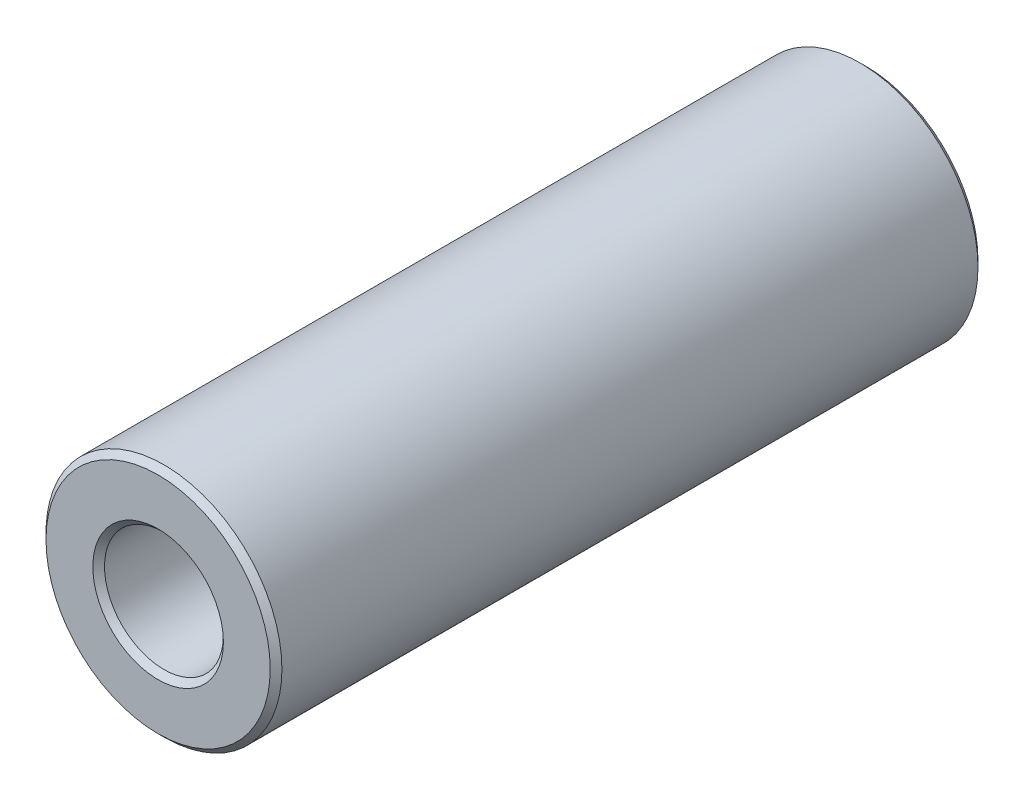
ISO-10303-21;
HEADER;
FILE_DESCRIPTION(('STEP AP214'),'2;1');
FILE_NAME('part.step','',(''),(''),'','','');
FILE_SCHEMA(('AUTOMOTIVE_DESIGN { 1 0 10303 214 1 1 1 1 }'));
ENDSEC;
DATA;
#1=APPLICATION_CONTEXT('core data for automotive mechanical design processes');
#2=APPLICATION_PROTOCOL_DEFINITION('international standard','automotive_design',2000,#1);
#3=PRODUCT_CONTEXT('',#1,'mechanical');
#4=PRODUCT('Part','Part','',(#3));
#5=PRODUCT_RELATED_PRODUCT_CATEGORY('part','',(#4));
#6=PRODUCT_DEFINITION_FORMATION('','',#4);
#7=PRODUCT_DEFINITION_CONTEXT('part definition',#1,'design');
#8=PRODUCT_DEFINITION('design','',#6,#7);
#9=PRODUCT_DEFINITION_SHAPE('','',#8);
#10=(LENGTH_UNIT() NAMED_UNIT(*) SI_UNIT(.MILLI.,.METRE.));
#11=(NAMED_UNIT(*) PLANE_ANGLE_UNIT() SI_UNIT($,.RADIAN.));
#12=(NAMED_UNIT(*) SI_UNIT($,.STERADIAN.) SOLID_ANGLE_UNIT());
#13=UNCERTAINTY_MEASURE_WITH_UNIT(LENGTH_MEASURE(1.E-05),#10,'distance_accuracy_value','');
#14=(GEOMETRIC_REPRESENTATION_CONTEXT(3) GLOBAL_UNCERTAINTY_ASSIGNED_CONTEXT((#13)) GLOBAL_UNIT_ASSIGNED_CONTEXT((#10,
#11,#12)) REPRESENTATION_CONTEXT('',''));
#15=CARTESIAN_POINT('',(0.,0.,0.));
#16=DIRECTION('',(0.,0.,1.));
#17=DIRECTION('',(1.,0.,0.));
#18=AXIS2_PLACEMENT_3D('',#15,#16,#17);
#19=CARTESIAN_POINT('',(0.,0.,-19.05));
#20=DIRECTION('',(0.,0.,1.));
#21=DIRECTION('',(1.,0.,0.));
#22=AXIS2_PLACEMENT_3D('',#19,#20,#21);
#23=CYLINDRICAL_SURFACE('',#22,6.35);
#24=CARTESIAN_POINT('',(0.,0.,18.73504));
#25=DIRECTION('',(0.,0.,1.));
#26=DIRECTION('',(1.,0.,0.));
#27=AXIS2_PLACEMENT_3D('',#24,#25,#26);
#28=CIRCLE('',#27,6.35);
#29=CARTESIAN_POINT('',(6.35,0.,18.73504));
#30=VERTEX_POINT('',#29);
#31=EDGE_CURVE('E55',#30,#30,#28,.F.);
#32=CARTESIAN_POINT('',(0.,0.,-18.73504));
#33=DIRECTION('',(0.,0.,1.));
#34=DIRECTION('',(1.,0.,0.));
#35=AXIS2_PLACEMENT_3D('',#32,#33,#34);
#36=CIRCLE('',#35,6.35);
#37=CARTESIAN_POINT('',(6.35,0.,-18.73504));
#38=VERTEX_POINT('',#37);
#39=EDGE_CURVE('E58',#38,#38,#36,.T.);
#40=CARTESIAN_POINT('',(6.35,0.,18.73504));
#41=CARTESIAN_POINT('',(6.35,0.,18.3447266666667));
#42=CARTESIAN_POINT('',(6.35,0.,17.9544133333333));
#43=CARTESIAN_POINT('',(6.35,0.,17.1737866666667));
#44=CARTESIAN_POINT('',(6.35,0.,16.7834733333333));
#45=CARTESIAN_POINT('',(6.35,0.,16.0028466666667));
#46=CARTESIAN_POINT('',(6.35,0.,15.6125333333333));
#47=CARTESIAN_POINT('',(6.35,0.,14.8319066666667));
#48=CARTESIAN_POINT('',(6.35,0.,14.4415933333333));
#49=CARTESIAN_POINT('',(6.35,0.,13.6609666666667));
#50=CARTESIAN_POINT('',(6.35,0.,13.2706533333333));
#51=CARTESIAN_POINT('',(6.35,0.,12.4900266666667));
#52=CARTESIAN_POINT('',(6.35,0.,12.0997133333333));
#53=CARTESIAN_POINT('',(6.35,0.,11.3190866666667));
#54=CARTESIAN_POINT('',(6.35,0.,10.9287733333333));
#55=CARTESIAN_POINT('',(6.35,0.,10.1481466666667));
#56=CARTESIAN_POINT('',(6.35,0.,9.75783333333334));
#57=CARTESIAN_POINT('',(6.35,0.,8.97720666666667));
#58=CARTESIAN_POINT('',(6.35,0.,8.58689333333334));
#59=CARTESIAN_POINT('',(6.35,0.,7.80626666666667));
#60=CARTESIAN_POINT('',(6.35,0.,7.41595333333334));
#61=CARTESIAN_POINT('',(6.35,0.,6.63532666666667));
#62=CARTESIAN_POINT('',(6.35,0.,6.24501333333334));
#63=CARTESIAN_POINT('',(6.35,0.,5.46438666666667));
#64=CARTESIAN_POINT('',(6.35,0.,5.07407333333334));
#65=CARTESIAN_POINT('',(6.35,0.,4.29344666666668));
#66=CARTESIAN_POINT('',(6.35,0.,3.90313333333334));
#67=CARTESIAN_POINT('',(6.35,0.,3.12250666666667));
#68=CARTESIAN_POINT('',(6.35,0.,2.73219333333334));
#69=CARTESIAN_POINT('',(6.35,0.,1.95156666666668));
#70=CARTESIAN_POINT('',(6.35,0.,1.56125333333334));
#71=CARTESIAN_POINT('',(6.35,0.,0.780626666666676));
#72=CARTESIAN_POINT('',(6.35,0.,0.390313333333343));
#73=CARTESIAN_POINT('',(6.35,0.,-0.390313333333323));
#74=CARTESIAN_POINT('',(6.35,0.,-0.780626666666655));
#75=CARTESIAN_POINT('',(6.35,0.,-1.56125333333332));
#76=CARTESIAN_POINT('',(6.35,0.,-1.95156666666665));
#77=CARTESIAN_POINT('',(6.35,0.,-2.73219333333332));
#78=CARTESIAN_POINT('',(6.35,0.,-3.12250666666665));
#79=CARTESIAN_POINT('',(6.35,0.,-3.90313333333332));
#80=CARTESIAN_POINT('',(6.35,0.,-4.29344666666665));
#81=CARTESIAN_POINT('',(6.35,0.,-5.07407333333332));
#82=CARTESIAN_POINT('',(6.35,0.,-5.46438666666665));
#83=CARTESIAN_POINT('',(6.35,0.,-6.24501333333332));
#84=CARTESIAN_POINT('',(6.35,0.,-6.63532666666665));
#85=CARTESIAN_POINT('',(6.35,0.,-7.41595333333332));
#86=CARTESIAN_POINT('',(6.35,0.,-7.80626666666665));
#87=CARTESIAN_POINT('',(6.35,0.,-8.58689333333332));
#88=CARTESIAN_POINT('',(6.35,0.,-8.97720666666665));
#89=CARTESIAN_POINT('',(6.35,0.,-9.75783333333332));
#90=CARTESIAN_POINT('',(6.35,0.,-10.1481466666666));
#91=CARTESIAN_POINT('',(6.35,0.,-10.9287733333333));
#92=CARTESIAN_POINT('',(6.35,0.,-11.3190866666666));
#93=CARTESIAN_POINT('',(6.35,0.,-12.0997133333333));
#94=CARTESIAN_POINT('',(6.35,0.,-12.4900266666666));
#95=CARTESIAN_POINT('',(6.35,0.,-13.2706533333333));
#96=CARTESIAN_POINT('',(6.35,0.,-13.6609666666666));
#97=CARTESIAN_POINT('',(6.35,0.,-14.4415933333333));
#98=CARTESIAN_POINT('',(6.35,0.,-14.8319066666666));
#99=CARTESIAN_POINT('',(6.35,0.,-15.6125333333333));
#100=CARTESIAN_POINT('',(6.35,0.,-16.0028466666666));
#101=CARTESIAN_POINT('',(6.35,0.,-16.7834733333333));
#102=CARTESIAN_POINT('',(6.35,0.,-17.1737866666666));
#103=CARTESIAN_POINT('',(6.35,0.,-17.9544133333333));
#104=CARTESIAN_POINT('',(6.35,0.,-18.3447266666666));
#105=CARTESIAN_POINT('',(6.35,0.,-18.73504));
#106=B_SPLINE_CURVE_WITH_KNOTS('',3,(#40,#41,#42,#43,#44,#45,#46,#47,#48,#49,#50,#51,#52,#53,
#54,#55,#56,#57,#58,#59,#60,#61,#62,#63,#64,#65,#66,#67,#68,#69,#70,#71,#72,#73,#74,#75,#76,#77,
#78,#79,#80,#81,#82,#83,#84,#85,#86,#87,#88,#89,#90,#91,#92,#93,#94,#95,#96,#97,#98,#99,#100,
#101,#102,#103,#104,#105),.UNSPECIFIED.,.F.,.F.,(4,2,2,2,2,2,2,2,2,2,2,2,2,2,2,2,2,2,2,2,2,2,2,
2,2,2,2,2,2,2,2,2,4),(0.,1.17094,2.34188,3.51282,4.68376,5.8547,7.02563999999999,
8.19657999999999,9.36751999999999,10.53846,11.7094,12.88034,14.05128,15.22222,16.39316,17.5641,
18.73504,19.90598,21.07692,22.24786,23.4188,24.58974,25.76068,26.93162,28.10256,29.2735,
30.44444,31.61538,32.78632,33.95726,35.1282,36.29914,37.47008),.UNSPECIFIED.);
#107=EDGE_CURVE('BSEAM35',#30,#38,#106,.T.);
#108=ORIENTED_EDGE('',*,*,#31,.T.);
#109=ORIENTED_EDGE('',*,*,#39,.T.);
#110=ORIENTED_EDGE('',*,*,#107,.T.);
#111=ORIENTED_EDGE('',*,*,#107,.F.);
#112=EDGE_LOOP('',(#108,#110,#109,#111));
#113=FACE_BOUND('',#112,.T.);
#114=ADVANCED_FACE('F35',(#113),#23,.T.);
#115=CARTESIAN_POINT('',(0.,0.,-19.05));
#116=DIRECTION('',(0.,0.,1.));
#117=DIRECTION('',(1.,0.,0.));
#118=AXIS2_PLACEMENT_3D('',#115,#116,#117);
#119=PLANE('',#118);
#120=CARTESIAN_POINT('',(0.,0.,-19.05));
#121=DIRECTION('',(0.,0.,1.));
#122=DIRECTION('',(1.,0.,0.));
#123=AXIS2_PLACEMENT_3D('',#120,#121,#122);
#124=CIRCLE('',#123,6.03503999999998);
#125=CARTESIAN_POINT('',(6.03503999999998,0.,-19.05));
#126=VERTEX_POINT('',#125);
#127=EDGE_CURVE('E46',#126,#126,#124,.F.);
#128=ORIENTED_EDGE('',*,*,#127,.T.);
#129=EDGE_LOOP('',(#128));
#130=FACE_BOUND('',#129,.T.);
#131=CARTESIAN_POINT('',(0.,0.,-19.05));
#132=DIRECTION('',(0.,0.,1.));
#133=DIRECTION('',(1.,0.,0.));
#134=AXIS2_PLACEMENT_3D('',#131,#132,#133);
#135=CIRCLE('',#134,3.51535999999998);
#136=CARTESIAN_POINT('',(3.51535999999998,0.,-19.05));
#137=VERTEX_POINT('',#136);
#138=EDGE_CURVE('E50',#137,#137,#135,.T.);
#139=ORIENTED_EDGE('',*,*,#138,.T.);
#140=EDGE_LOOP('',(#139));
#141=FACE_BOUND('',#140,.T.);
#142=ADVANCED_FACE('F83',(#130,#141),#119,.F.);
#143=CARTESIAN_POINT('',(0.,0.,-19.05));
#144=DIRECTION('',(0.,0.,1.));
#145=DIRECTION('',(1.,0.,0.));
#146=AXIS2_PLACEMENT_3D('',#143,#144,#145);
#147=CYLINDRICAL_SURFACE('',#146,3.2004);
#148=CARTESIAN_POINT('',(0.,0.,18.73504));
#149=DIRECTION('',(0.,0.,1.));
#150=DIRECTION('',(1.,0.,0.));
#151=AXIS2_PLACEMENT_3D('',#148,#149,#150);
#152=CIRCLE('',#151,3.2004);
#153=CARTESIAN_POINT('',(3.2004,0.,18.73504));
#154=VERTEX_POINT('',#153);
#155=EDGE_CURVE('E10',#154,#154,#152,.T.);
#156=CARTESIAN_POINT('',(0.,0.,-18.73504));
#157=DIRECTION('',(0.,0.,1.));
#158=DIRECTION('',(1.,0.,0.));
#159=AXIS2_PLACEMENT_3D('',#156,#157,#158);
#160=CIRCLE('',#159,3.2004);
#161=CARTESIAN_POINT('',(3.2004,0.,-18.73504));
#162=VERTEX_POINT('',#161);
#163=EDGE_CURVE('E42',#162,#162,#160,.F.);
#164=CARTESIAN_POINT('',(3.2004,0.,18.73504));
#165=CARTESIAN_POINT('',(3.2004,0.,18.3447266666666));
#166=CARTESIAN_POINT('',(3.2004,0.,17.9544133333333));
#167=CARTESIAN_POINT('',(3.2004,0.,17.1737866666666));
#168=CARTESIAN_POINT('',(3.2004,0.,16.7834733333333));
#169=CARTESIAN_POINT('',(3.2004,0.,16.0028466666666));
#170=CARTESIAN_POINT('',(3.2004,0.,15.6125333333333));
#171=CARTESIAN_POINT('',(3.2004,0.,14.8319066666666));
#172=CARTESIAN_POINT('',(3.2004,0.,14.4415933333333));
#173=CARTESIAN_POINT('',(3.2004,0.,13.6609666666666));
#174=CARTESIAN_POINT('',(3.2004,0.,13.2706533333333));
#175=CARTESIAN_POINT('',(3.2004,0.,12.4900266666666));
#176=CARTESIAN_POINT('',(3.2004,0.,12.0997133333333));
#177=CARTESIAN_POINT('',(3.2004,0.,11.3190866666666));
#178=CARTESIAN_POINT('',(3.2004,0.,10.9287733333333));
#179=CARTESIAN_POINT('',(3.2004,0.,10.1481466666666));
#180=CARTESIAN_POINT('',(3.2004,0.,9.75783333333329));
#181=CARTESIAN_POINT('',(3.2004,0.,8.97720666666663));
#182=CARTESIAN_POINT('',(3.2004,0.,8.5868933333333));
#183=CARTESIAN_POINT('',(3.2004,0.,7.80626666666663));
#184=CARTESIAN_POINT('',(3.2004,0.,7.4159533333333));
#185=CARTESIAN_POINT('',(3.2004,0.,6.63532666666663));
#186=CARTESIAN_POINT('',(3.2004,0.,6.2450133333333));
#187=CARTESIAN_POINT('',(3.2004,0.,5.46438666666663));
#188=CARTESIAN_POINT('',(3.2004,0.,5.0740733333333));
#189=CARTESIAN_POINT('',(3.2004,0.,4.29344666666663));
#190=CARTESIAN_POINT('',(3.2004,0.,3.9031333333333));
#191=CARTESIAN_POINT('',(3.2004,0.,3.12250666666663));
#192=CARTESIAN_POINT('',(3.2004,0.,2.7321933333333));
#193=CARTESIAN_POINT('',(3.2004,0.,1.95156666666663));
#194=CARTESIAN_POINT('',(3.2004,0.,1.5612533333333));
#195=CARTESIAN_POINT('',(3.2004,0.,0.780626666666631));
#196=CARTESIAN_POINT('',(3.2004,0.,0.390313333333298));
#197=CARTESIAN_POINT('',(3.2004,0.,-0.390313333333368));
#198=CARTESIAN_POINT('',(3.2004,0.,-0.7806266666667));
#199=CARTESIAN_POINT('',(3.2004,0.,-1.56125333333337));
#200=CARTESIAN_POINT('',(3.2004,0.,-1.9515666666667));
#201=CARTESIAN_POINT('',(3.2004,0.,-2.73219333333337));
#202=CARTESIAN_POINT('',(3.2004,0.,-3.1225066666667));
#203=CARTESIAN_POINT('',(3.2004,0.,-3.90313333333337));
#204=CARTESIAN_POINT('',(3.2004,0.,-4.2934466666667));
#205=CARTESIAN_POINT('',(3.2004,0.,-5.07407333333336));
#206=CARTESIAN_POINT('',(3.2004,0.,-5.4643866666667));
#207=CARTESIAN_POINT('',(3.2004,0.,-6.24501333333336));
#208=CARTESIAN_POINT('',(3.2004,0.,-6.6353266666667));
#209=CARTESIAN_POINT('',(3.2004,0.,-7.41595333333337));
#210=CARTESIAN_POINT('',(3.2004,0.,-7.8062666666667));
#211=CARTESIAN_POINT('',(3.2004,0.,-8.58689333333336));
#212=CARTESIAN_POINT('',(3.2004,0.,-8.9772066666667));
#213=CARTESIAN_POINT('',(3.2004,0.,-9.75783333333336));
#214=CARTESIAN_POINT('',(3.2004,0.,-10.1481466666667));
#215=CARTESIAN_POINT('',(3.2004,0.,-10.9287733333334));
#216=CARTESIAN_POINT('',(3.2004,0.,-11.3190866666667));
#217=CARTESIAN_POINT('',(3.2004,0.,-12.0997133333334));
#218=CARTESIAN_POINT('',(3.2004,0.,-12.4900266666667));
#219=CARTESIAN_POINT('',(3.2004,0.,-13.2706533333334));
#220=CARTESIAN_POINT('',(3.2004,0.,-13.6609666666667));
#221=CARTESIAN_POINT('',(3.2004,0.,-14.4415933333334));
#222=CARTESIAN_POINT('',(3.2004,0.,-14.8319066666667));
#223=CARTESIAN_POINT('',(3.2004,0.,-15.6125333333334));
#224=CARTESIAN_POINT('',(3.2004,0.,-16.0028466666667));
#225=CARTESIAN_POINT('',(3.2004,0.,-16.7834733333334));
#226=CARTESIAN_POINT('',(3.2004,0.,-17.1737866666667));
#227=CARTESIAN_POINT('',(3.2004,0.,-17.9544133333334));
#228=CARTESIAN_POINT('',(3.2004,0.,-18.3447266666667));
#229=CARTESIAN_POINT('',(3.2004,0.,-18.73504));
#230=B_SPLINE_CURVE_WITH_KNOTS('',3,(#164,#165,#166,#167,#168,#169,#170,#171,#172,#173,#174,
#175,#176,#177,#178,#179,#180,#181,#182,#183,#184,#185,#186,#187,#188,#189,#190,#191,#192,#193,
#194,#195,#196,#197,#198,#199,#200,#201,#202,#203,#204,#205,#206,#207,#208,#209,#210,#211,#212,
#213,#214,#215,#216,#217,#218,#219,#220,#221,#222,#223,#224,#225,#226,#227,#228,#229),
.UNSPECIFIED.,.F.,.F.,(4,2,2,2,2,2,2,2,2,2,2,2,2,2,2,2,2,2,2,2,2,2,2,2,2,2,2,2,2,2,2,2,4),(0.,
1.17094,2.34188,3.51282,4.68376,5.8547,7.02564,8.19658,9.36751999999999,10.53846,11.7094,
12.88034,14.05128,15.22222,16.39316,17.5641,18.73504,19.90598,21.07692,22.24786,23.4188,
24.58974,25.76068,26.93162,28.10256,29.2735,30.44444,31.61538,32.78632,33.95726,35.1282,
36.29914,37.47008),.UNSPECIFIED.);
#231=EDGE_CURVE('BSEAM89',#154,#162,#230,.T.);
#232=ORIENTED_EDGE('',*,*,#155,.T.);
#233=ORIENTED_EDGE('',*,*,#163,.T.);
#234=ORIENTED_EDGE('',*,*,#231,.T.);
#235=ORIENTED_EDGE('',*,*,#231,.F.);
#236=EDGE_LOOP('',(#232,#234,#233,#235));
#237=FACE_BOUND('',#236,.T.);
#238=ADVANCED_FACE('F89',(#237),#147,.F.);
#239=CARTESIAN_POINT('',(0.,0.,19.05));
#240=DIRECTION('',(0.,0.,1.));
#241=DIRECTION('',(1.,0.,0.));
#242=AXIS2_PLACEMENT_3D('',#239,#240,#241);
#243=PLANE('',#242);
#244=CARTESIAN_POINT('',(0.,0.,19.05));
#245=DIRECTION('',(0.,0.,1.));
#246=DIRECTION('',(1.,0.,0.));
#247=AXIS2_PLACEMENT_3D('',#244,#245,#246);
#248=CIRCLE('',#247,6.03504);
#249=CARTESIAN_POINT('',(6.03504,0.,19.05));
#250=VERTEX_POINT('',#249);
#251=EDGE_CURVE('E61',#250,#250,#248,.T.);
#252=ORIENTED_EDGE('',*,*,#251,.T.);
#253=EDGE_LOOP('',(#252));
#254=FACE_BOUND('',#253,.T.);
#255=CARTESIAN_POINT('',(0.,0.,19.05));
#256=DIRECTION('',(0.,0.,1.));
#257=DIRECTION('',(1.,0.,0.));
#258=AXIS2_PLACEMENT_3D('',#255,#256,#257);
#259=CIRCLE('',#258,3.51536000000004);
#260=CARTESIAN_POINT('',(3.51536000000003,0.,19.05));
#261=VERTEX_POINT('',#260);
#262=EDGE_CURVE('E64',#261,#261,#259,.F.);
#263=ORIENTED_EDGE('',*,*,#262,.T.);
#264=EDGE_LOOP('',(#263));
#265=FACE_BOUND('',#264,.T.);
#266=ADVANCED_FACE('F68',(#254,#265),#243,.T.);
#267=CARTESIAN_POINT('',(0.,0.,19.05));
#268=DIRECTION('',(0.,0.,-1.));
#269=DIRECTION('',(-1.,0.,0.));
#270=AXIS2_PLACEMENT_3D('',#267,#268,#269);
#271=CONICAL_SURFACE('',#270,6.03504,0.785398163397452);
#272=ORIENTED_EDGE('',*,*,#31,.F.);
#273=EDGE_LOOP('',(#272));
#274=FACE_BOUND('',#273,.T.);
#275=ORIENTED_EDGE('',*,*,#251,.F.);
#276=EDGE_LOOP('',(#275));
#277=FACE_BOUND('',#276,.T.);
#278=ADVANCED_FACE('F79',(#274,#277),#271,.T.);
#279=CARTESIAN_POINT('',(0.,0.,-18.73504));
#280=DIRECTION('',(0.,0.,1.));
#281=DIRECTION('',(1.,0.,0.));
#282=AXIS2_PLACEMENT_3D('',#279,#280,#281);
#283=CONICAL_SURFACE('',#282,6.35,0.785398163397441);
#284=ORIENTED_EDGE('',*,*,#127,.F.);
#285=EDGE_LOOP('',(#284));
#286=FACE_BOUND('',#285,.T.);
#287=ORIENTED_EDGE('',*,*,#39,.F.);
#288=EDGE_LOOP('',(#287));
#289=FACE_BOUND('',#288,.T.);
#290=ADVANCED_FACE('F73',(#286,#289),#283,.T.);
#291=CARTESIAN_POINT('',(0.,0.,18.73504));
#292=DIRECTION('',(0.,0.,1.));
#293=DIRECTION('',(1.,0.,0.));
#294=AXIS2_PLACEMENT_3D('',#291,#292,#293);
#295=CONICAL_SURFACE('',#294,3.2004,0.785398163397446);
#296=CARTESIAN_POINT('',(3.51536000000003,0.,19.05));
#297=CARTESIAN_POINT('',(3.5120791666667,0.,19.0467191666667));
#298=CARTESIAN_POINT('',(3.50879833333337,0.,19.0434383333333));
#299=CARTESIAN_POINT('',(3.5022366666667,0.,19.0368766666667));
#300=CARTESIAN_POINT('',(3.49895583333337,0.,19.0335958333333));
#301=CARTESIAN_POINT('',(3.4923941666667,0.,19.0270341666667));
#302=CARTESIAN_POINT('',(3.48911333333336,0.,19.0237533333333));
#303=CARTESIAN_POINT('',(3.4825516666667,0.,19.0171916666667));
#304=CARTESIAN_POINT('',(3.47927083333336,0.,19.0139108333333));
#305=CARTESIAN_POINT('',(3.4727091666667,0.,19.0073491666667));
#306=CARTESIAN_POINT('',(3.46942833333336,0.,19.0040683333333));
#307=CARTESIAN_POINT('',(3.46286666666669,0.,18.9975066666667));
#308=CARTESIAN_POINT('',(3.45958583333336,0.,18.9942258333333));
#309=CARTESIAN_POINT('',(3.45302416666669,0.,18.9876641666667));
#310=CARTESIAN_POINT('',(3.44974333333336,0.,18.9843833333333));
#311=CARTESIAN_POINT('',(3.44318166666669,0.,18.9778216666667));
#312=CARTESIAN_POINT('',(3.43990083333336,0.,18.9745408333333));
#313=CARTESIAN_POINT('',(3.43333916666669,0.,18.9679791666667));
#314=CARTESIAN_POINT('',(3.43005833333336,0.,18.9646983333333));
#315=CARTESIAN_POINT('',(3.42349666666669,0.,18.9581366666667));
#316=CARTESIAN_POINT('',(3.42021583333336,0.,18.9548558333333));
#317=CARTESIAN_POINT('',(3.41365416666669,0.,18.9482941666666));
#318=CARTESIAN_POINT('',(3.41037333333335,0.,18.9450133333333));
#319=CARTESIAN_POINT('',(3.40381166666669,0.,18.9384516666667));
#320=CARTESIAN_POINT('',(3.40053083333335,0.,18.9351708333333));
#321=CARTESIAN_POINT('',(3.39396916666668,0.,18.9286091666666));
#322=CARTESIAN_POINT('',(3.39068833333335,0.,18.9253283333333));
#323=CARTESIAN_POINT('',(3.38412666666668,0.,18.9187666666666));
#324=CARTESIAN_POINT('',(3.38084583333335,0.,18.9154858333333));
#325=CARTESIAN_POINT('',(3.37428416666668,0.,18.9089241666666));
#326=CARTESIAN_POINT('',(3.37100333333335,0.,18.9056433333333));
#327=CARTESIAN_POINT('',(3.36444166666668,0.,18.8990816666666));
#328=CARTESIAN_POINT('',(3.36116083333335,0.,18.8958008333333));
#329=CARTESIAN_POINT('',(3.35459916666668,0.,18.8892391666666));
#330=CARTESIAN_POINT('',(3.35131833333335,0.,18.8859583333333));
#331=CARTESIAN_POINT('',(3.34475666666668,0.,18.8793966666666));
#332=CARTESIAN_POINT('',(3.34147583333334,0.,18.8761158333333));
#333=CARTESIAN_POINT('',(3.33491416666668,0.,18.8695541666666));
#334=CARTESIAN_POINT('',(3.33163333333334,0.,18.8662733333333));
#335=CARTESIAN_POINT('',(3.32507166666667,0.,18.8597116666666));
#336=CARTESIAN_POINT('',(3.32179083333334,0.,18.8564308333333));
#337=CARTESIAN_POINT('',(3.31522916666667,0.,18.8498691666666));
#338=CARTESIAN_POINT('',(3.31194833333334,0.,18.8465883333333));
#339=CARTESIAN_POINT('',(3.30538666666667,0.,18.8400266666666));
#340=CARTESIAN_POINT('',(3.30210583333334,0.,18.8367458333333));
#341=CARTESIAN_POINT('',(3.29554416666667,0.,18.8301841666666));
#342=CARTESIAN_POINT('',(3.29226333333334,0.,18.8269033333333));
#343=CARTESIAN_POINT('',(3.28570166666667,0.,18.8203416666666));
#344=CARTESIAN_POINT('',(3.28242083333334,0.,18.8170608333333));
#345=CARTESIAN_POINT('',(3.27585916666667,0.,18.8104991666666));
#346=CARTESIAN_POINT('',(3.27257833333333,0.,18.8072183333333));
#347=CARTESIAN_POINT('',(3.26601666666667,0.,18.8006566666666));
#348=CARTESIAN_POINT('',(3.26273583333333,0.,18.7973758333333));
#349=CARTESIAN_POINT('',(3.25617416666667,0.,18.7908141666666));
#350=CARTESIAN_POINT('',(3.25289333333333,0.,18.7875333333333));
#351=CARTESIAN_POINT('',(3.24633166666666,0.,18.7809716666666));
#352=CARTESIAN_POINT('',(3.24305083333333,0.,18.7776908333333));
#353=CARTESIAN_POINT('',(3.23648916666666,0.,18.7711291666666));
#354=CARTESIAN_POINT('',(3.23320833333333,0.,18.7678483333333));
#355=CARTESIAN_POINT('',(3.22664666666666,0.,18.7612866666666));
#356=CARTESIAN_POINT('',(3.22336583333333,0.,18.7580058333333));
#357=CARTESIAN_POINT('',(3.21680416666666,0.,18.7514441666666));
#358=CARTESIAN_POINT('',(3.21352333333333,0.,18.7481633333333));
#359=CARTESIAN_POINT('',(3.20696166666666,0.,18.7416016666666));
#360=CARTESIAN_POINT('',(3.20368083333333,0.,18.7383208333333));
#361=CARTESIAN_POINT('',(3.20039999999999,0.,18.73504));
#362=B_SPLINE_CURVE_WITH_KNOTS('',3,(#296,#297,#298,#299,#300,#301,#302,#303,#304,#305,#306,
#307,#308,#309,#310,#311,#312,#313,#314,#315,#316,#317,#318,#319,#320,#321,#322,#323,#324,#325,
#326,#327,#328,#329,#330,#331,#332,#333,#334,#335,#336,#337,#338,#339,#340,#341,#342,#343,#344,
#345,#346,#347,#348,#349,#350,#351,#352,#353,#354,#355,#356,#357,#358,#359,#360,#361),
.UNSPECIFIED.,.F.,.F.,(4,2,2,2,2,2,2,2,2,2,2,2,2,2,2,2,2,2,2,2,2,2,2,2,2,2,2,2,2,2,2,2,4),(0.,
0.0139193969876601,0.0278387939753202,0.0417581909629778,0.0556775879506376,0.0695969849382976,
0.0835163819259553,0.0974357789136154,0.111355175901273,0.125274572888933,0.139193969876593,
0.153113366864251,0.167032763851911,0.180952160839571,0.194871557827229,0.208790954814888,
0.222710351802546,0.236629748790206,0.250549145777866,0.264468542765524,0.278387939753184,
0.292307336740844,0.306226733728502,0.320146130716162,0.334065527703819,0.347984924691479,
0.361904321679139,0.375823718666797,0.389743115654457,0.403662512642117,0.417581909629774,
0.431501306617435,0.445420703605092),.UNSPECIFIED.);
#363=EDGE_CURVE('BSEAM70',#261,#154,#362,.T.);
#364=ORIENTED_EDGE('',*,*,#262,.F.);
#365=ORIENTED_EDGE('',*,*,#155,.F.);
#366=ORIENTED_EDGE('',*,*,#363,.T.);
#367=ORIENTED_EDGE('',*,*,#363,.F.);
#368=EDGE_LOOP('',(#364,#366,#365,#367));
#369=FACE_BOUND('',#368,.T.);
#370=ADVANCED_FACE('F70',(#369),#295,.F.);
#371=CARTESIAN_POINT('',(0.,0.,-19.05));
#372=DIRECTION('',(0.,0.,-1.));
#373=DIRECTION('',(-1.,0.,0.));
#374=AXIS2_PLACEMENT_3D('',#371,#372,#373);
#375=CONICAL_SURFACE('',#374,3.51535999999998,0.785398163397452);
#376=ORIENTED_EDGE('',*,*,#163,.F.);
#377=EDGE_LOOP('',(#376));
#378=FACE_BOUND('',#377,.T.);
#379=ORIENTED_EDGE('',*,*,#138,.F.);
#380=EDGE_LOOP('',(#379));
#381=FACE_BOUND('',#380,.T.);
#382=ADVANCED_FACE('F37',(#378,#381),#375,.F.);
#383=CLOSED_SHELL('',(#114,#142,#238,#266,#278,#290,#370,#382));
#384=MANIFOLD_SOLID_BREP('B2',#383);
#385=ADVANCED_BREP_SHAPE_REPRESENTATION('',(#18,#384),#14);
#386=SHAPE_DEFINITION_REPRESENTATION(#9,#385);
ENDSEC;
END-ISO-10303-21;
